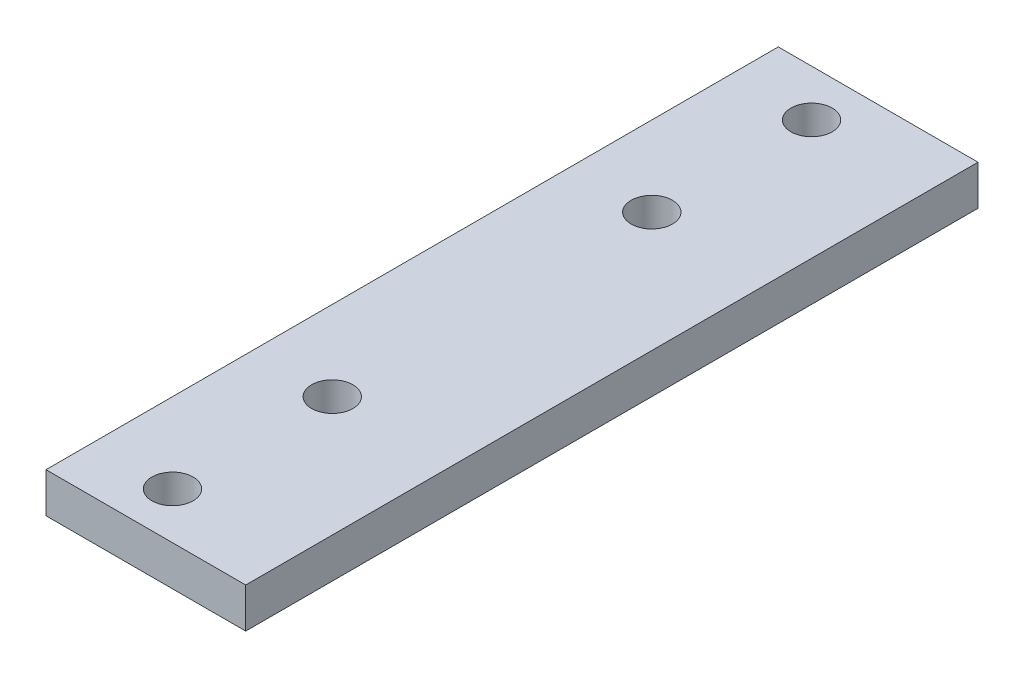
ISO-10303-21;
HEADER;
FILE_DESCRIPTION(('STEP AP214'),'2;1');
FILE_NAME('part.step','',(''),(''),'','','');
FILE_SCHEMA(('AUTOMOTIVE_DESIGN { 1 0 10303 214 1 1 1 1 }'));
ENDSEC;
DATA;
#1=APPLICATION_CONTEXT('core data for automotive mechanical design processes');
#2=APPLICATION_PROTOCOL_DEFINITION('international standard','automotive_design',2000,#1);
#3=PRODUCT_CONTEXT('',#1,'mechanical');
#4=PRODUCT('Part','Part','',(#3));
#5=PRODUCT_RELATED_PRODUCT_CATEGORY('part','',(#4));
#6=PRODUCT_DEFINITION_FORMATION('','',#4);
#7=PRODUCT_DEFINITION_CONTEXT('part definition',#1,'design');
#8=PRODUCT_DEFINITION('design','',#6,#7);
#9=PRODUCT_DEFINITION_SHAPE('','',#8);
#10=(LENGTH_UNIT() NAMED_UNIT(*) SI_UNIT(.MILLI.,.METRE.));
#11=(NAMED_UNIT(*) PLANE_ANGLE_UNIT() SI_UNIT($,.RADIAN.));
#12=(NAMED_UNIT(*) SI_UNIT($,.STERADIAN.) SOLID_ANGLE_UNIT());
#13=UNCERTAINTY_MEASURE_WITH_UNIT(LENGTH_MEASURE(1.E-05),#10,'distance_accuracy_value','');
#14=(GEOMETRIC_REPRESENTATION_CONTEXT(3) GLOBAL_UNCERTAINTY_ASSIGNED_CONTEXT((#13)) GLOBAL_UNIT_ASSIGNED_CONTEXT((#10,
#11,#12)) REPRESENTATION_CONTEXT('',''));
#15=CARTESIAN_POINT('',(0.,0.,0.));
#16=DIRECTION('',(0.,0.,1.));
#17=DIRECTION('',(1.,0.,0.));
#18=AXIS2_PLACEMENT_3D('',#15,#16,#17);
#19=CARTESIAN_POINT('',(0.,0.,-5.));
#20=DIRECTION('',(0.,0.,-1.));
#21=DIRECTION('',(-1.,0.,0.));
#22=AXIS2_PLACEMENT_3D('',#19,#20,#21);
#23=PLANE('',#22);
#24=DIRECTION('',(0.,-1.,0.));
#25=VECTOR('',#24,1.);
#26=CARTESIAN_POINT('',(35.,3.,-5.));
#27=LINE('',#26,#25);
#28=CARTESIAN_POINT('',(35.,3.,-5.));
#29=VERTEX_POINT('',#28);
#30=CARTESIAN_POINT('',(35.,0.,-5.));
#31=VERTEX_POINT('',#30);
#32=EDGE_CURVE('E54',#29,#31,#27,.T.);
#33=ORIENTED_EDGE('',*,*,#32,.T.);
#34=DIRECTION('',(1.,0.,0.));
#35=VECTOR('',#34,1.);
#36=CARTESIAN_POINT('',(-30.,0.,-5.));
#37=LINE('',#36,#35);
#38=CARTESIAN_POINT('',(20.,0.,-5.));
#39=VERTEX_POINT('',#38);
#40=EDGE_CURVE('E93',#39,#31,#37,.T.);
#41=ORIENTED_EDGE('',*,*,#40,.F.);
#42=DIRECTION('',(0.,-1.,0.));
#43=VECTOR('',#42,1.);
#44=CARTESIAN_POINT('',(20.,3.,-5.));
#45=LINE('',#44,#43);
#46=CARTESIAN_POINT('',(20.,3.,-5.));
#47=VERTEX_POINT('',#46);
#48=EDGE_CURVE('E108',#47,#39,#45,.T.);
#49=ORIENTED_EDGE('',*,*,#48,.F.);
#50=DIRECTION('',(-1.,0.,0.));
#51=VECTOR('',#50,1.);
#52=CARTESIAN_POINT('',(35.,3.,-5.));
#53=LINE('',#52,#51);
#54=EDGE_CURVE('E145',#29,#47,#53,.T.);
#55=ORIENTED_EDGE('',*,*,#54,.F.);
#56=EDGE_LOOP('',(#33,#41,#49,#55));
#57=FACE_BOUND('',#56,.T.);
#58=ADVANCED_FACE('F46',(#57),#23,.T.);
#59=CARTESIAN_POINT('',(0.,0.,50.));
#60=DIRECTION('',(0.,0.,1.));
#61=DIRECTION('',(-1.,0.,0.));
#62=AXIS2_PLACEMENT_3D('',#59,#60,#61);
#63=PLANE('',#62);
#64=DIRECTION('',(0.,-1.,0.));
#65=VECTOR('',#64,1.);
#66=CARTESIAN_POINT('',(20.,3.,50.));
#67=LINE('',#66,#65);
#68=CARTESIAN_POINT('',(20.,3.,50.));
#69=VERTEX_POINT('',#68);
#70=CARTESIAN_POINT('',(20.,0.,50.));
#71=VERTEX_POINT('',#70);
#72=EDGE_CURVE('E102',#69,#71,#67,.T.);
#73=ORIENTED_EDGE('',*,*,#72,.T.);
#74=DIRECTION('',(1.,0.,0.));
#75=VECTOR('',#74,1.);
#76=CARTESIAN_POINT('',(-30.,0.,50.));
#77=LINE('',#76,#75);
#78=CARTESIAN_POINT('',(35.,0.,50.));
#79=VERTEX_POINT('',#78);
#80=EDGE_CURVE('E90',#71,#79,#77,.T.);
#81=ORIENTED_EDGE('',*,*,#80,.T.);
#82=DIRECTION('',(0.,-1.,0.));
#83=VECTOR('',#82,1.);
#84=CARTESIAN_POINT('',(35.,3.,50.));
#85=LINE('',#84,#83);
#86=CARTESIAN_POINT('',(35.,3.,50.));
#87=VERTEX_POINT('',#86);
#88=EDGE_CURVE('E100',#87,#79,#85,.T.);
#89=ORIENTED_EDGE('',*,*,#88,.F.);
#90=DIRECTION('',(1.,0.,0.));
#91=VECTOR('',#90,1.);
#92=CARTESIAN_POINT('',(35.,3.,50.));
#93=LINE('',#92,#91);
#94=EDGE_CURVE('E62',#69,#87,#93,.T.);
#95=ORIENTED_EDGE('',*,*,#94,.F.);
#96=EDGE_LOOP('',(#73,#81,#89,#95));
#97=FACE_BOUND('',#96,.T.);
#98=ADVANCED_FACE('F99',(#97),#63,.T.);
#99=CARTESIAN_POINT('',(26.,-2.,-1.5));
#100=DIRECTION('',(0.,1.,0.));
#101=DIRECTION('',(0.,0.,1.));
#102=AXIS2_PLACEMENT_3D('',#99,#100,#101);
#103=CYLINDRICAL_SURFACE('',#102,1.55);
#104=CARTESIAN_POINT('',(26.,3.,-1.5));
#105=DIRECTION('',(0.,1.,0.));
#106=DIRECTION('',(0.,0.,1.));
#107=AXIS2_PLACEMENT_3D('',#104,#105,#106);
#108=CIRCLE('',#107,1.55);
#109=CARTESIAN_POINT('',(26.,3.,0.0499999999999999));
#110=VERTEX_POINT('',#109);
#111=EDGE_CURVE('E140',#110,#110,#108,.T.);
#112=ORIENTED_EDGE('',*,*,#111,.T.);
#113=EDGE_LOOP('',(#112));
#114=FACE_BOUND('',#113,.T.);
#115=CARTESIAN_POINT('',(26.,0.,-1.5));
#116=DIRECTION('',(0.,-1.,0.));
#117=DIRECTION('',(0.,0.,-1.));
#118=AXIS2_PLACEMENT_3D('',#115,#116,#117);
#119=CIRCLE('',#118,1.55);
#120=CARTESIAN_POINT('',(26.,0.,-3.05));
#121=VERTEX_POINT('',#120);
#122=EDGE_CURVE('E49',#121,#121,#119,.F.);
#123=ORIENTED_EDGE('',*,*,#122,.F.);
#124=EDGE_LOOP('',(#123));
#125=FACE_BOUND('',#124,.T.);
#126=ADVANCED_FACE('F167',(#114,#125),#103,.F.);
#127=CARTESIAN_POINT('',(26.,-2.,10.5));
#128=DIRECTION('',(0.,1.,0.));
#129=DIRECTION('',(0.,0.,1.));
#130=AXIS2_PLACEMENT_3D('',#127,#128,#129);
#131=CYLINDRICAL_SURFACE('',#130,1.55);
#132=CARTESIAN_POINT('',(26.,3.,10.5));
#133=DIRECTION('',(0.,1.,0.));
#134=DIRECTION('',(0.,0.,1.));
#135=AXIS2_PLACEMENT_3D('',#132,#133,#134);
#136=CIRCLE('',#135,1.55);
#137=CARTESIAN_POINT('',(26.,3.,12.05));
#138=VERTEX_POINT('',#137);
#139=EDGE_CURVE('E135',#138,#138,#136,.T.);
#140=ORIENTED_EDGE('',*,*,#139,.T.);
#141=EDGE_LOOP('',(#140));
#142=FACE_BOUND('',#141,.T.);
#143=CARTESIAN_POINT('',(26.,0.,10.5));
#144=DIRECTION('',(0.,-1.,0.));
#145=DIRECTION('',(0.,0.,-1.));
#146=AXIS2_PLACEMENT_3D('',#143,#144,#145);
#147=CIRCLE('',#146,1.55);
#148=CARTESIAN_POINT('',(26.,0.,8.95));
#149=VERTEX_POINT('',#148);
#150=EDGE_CURVE('E121',#149,#149,#147,.F.);
#151=ORIENTED_EDGE('',*,*,#150,.F.);
#152=EDGE_LOOP('',(#151));
#153=FACE_BOUND('',#152,.T.);
#154=ADVANCED_FACE('F171',(#142,#153),#131,.F.);
#155=CARTESIAN_POINT('',(26.,-2.,34.5));
#156=DIRECTION('',(0.,1.,0.));
#157=DIRECTION('',(0.,0.,1.));
#158=AXIS2_PLACEMENT_3D('',#155,#156,#157);
#159=CYLINDRICAL_SURFACE('',#158,1.55);
#160=CARTESIAN_POINT('',(26.,3.,34.5));
#161=DIRECTION('',(0.,1.,0.));
#162=DIRECTION('',(0.,0.,-1.));
#163=AXIS2_PLACEMENT_3D('',#160,#161,#162);
#164=CIRCLE('',#163,1.55);
#165=CARTESIAN_POINT('',(26.,3.,32.95));
#166=VERTEX_POINT('',#165);
#167=EDGE_CURVE('E130',#166,#166,#164,.T.);
#168=ORIENTED_EDGE('',*,*,#167,.T.);
#169=EDGE_LOOP('',(#168));
#170=FACE_BOUND('',#169,.T.);
#171=CARTESIAN_POINT('',(26.,0.,34.5));
#172=DIRECTION('',(0.,-1.,0.));
#173=DIRECTION('',(0.,0.,-1.));
#174=AXIS2_PLACEMENT_3D('',#171,#172,#173);
#175=CIRCLE('',#174,1.55);
#176=CARTESIAN_POINT('',(26.,0.,32.95));
#177=VERTEX_POINT('',#176);
#178=EDGE_CURVE('E119',#177,#177,#175,.F.);
#179=ORIENTED_EDGE('',*,*,#178,.F.);
#180=EDGE_LOOP('',(#179));
#181=FACE_BOUND('',#180,.T.);
#182=ADVANCED_FACE('F177',(#170,#181),#159,.F.);
#183=CARTESIAN_POINT('',(26.,-2.,46.5));
#184=DIRECTION('',(0.,1.,0.));
#185=DIRECTION('',(0.,0.,1.));
#186=AXIS2_PLACEMENT_3D('',#183,#184,#185);
#187=CYLINDRICAL_SURFACE('',#186,1.55);
#188=CARTESIAN_POINT('',(26.,3.,46.5));
#189=DIRECTION('',(0.,1.,0.));
#190=DIRECTION('',(0.,0.,-1.));
#191=AXIS2_PLACEMENT_3D('',#188,#189,#190);
#192=CIRCLE('',#191,1.55);
#193=CARTESIAN_POINT('',(26.,3.,44.95));
#194=VERTEX_POINT('',#193);
#195=EDGE_CURVE('E126',#194,#194,#192,.T.);
#196=ORIENTED_EDGE('',*,*,#195,.T.);
#197=EDGE_LOOP('',(#196));
#198=FACE_BOUND('',#197,.T.);
#199=CARTESIAN_POINT('',(26.,0.,46.5));
#200=DIRECTION('',(0.,-1.,0.));
#201=DIRECTION('',(0.,0.,-1.));
#202=AXIS2_PLACEMENT_3D('',#199,#200,#201);
#203=CIRCLE('',#202,1.55);
#204=CARTESIAN_POINT('',(26.,0.,44.95));
#205=VERTEX_POINT('',#204);
#206=EDGE_CURVE('E103',#205,#205,#203,.F.);
#207=ORIENTED_EDGE('',*,*,#206,.F.);
#208=EDGE_LOOP('',(#207));
#209=FACE_BOUND('',#208,.T.);
#210=ADVANCED_FACE('F161',(#198,#209),#187,.F.);
#211=CARTESIAN_POINT('',(35.,3.,-5.));
#212=DIRECTION('',(-1.,0.,0.));
#213=DIRECTION('',(0.,0.,1.));
#214=AXIS2_PLACEMENT_3D('',#211,#212,#213);
#215=PLANE('',#214);
#216=DIRECTION('',(0.,0.,-1.));
#217=VECTOR('',#216,1.);
#218=CARTESIAN_POINT('',(35.,0.,45.));
#219=LINE('',#218,#217);
#220=EDGE_CURVE('E11',#79,#31,#219,.T.);
#221=ORIENTED_EDGE('',*,*,#220,.T.);
#222=ORIENTED_EDGE('',*,*,#32,.F.);
#223=DIRECTION('',(0.,0.,-1.));
#224=VECTOR('',#223,1.);
#225=CARTESIAN_POINT('',(35.,3.,-5.));
#226=LINE('',#225,#224);
#227=EDGE_CURVE('E106',#87,#29,#226,.T.);
#228=ORIENTED_EDGE('',*,*,#227,.F.);
#229=ORIENTED_EDGE('',*,*,#88,.T.);
#230=EDGE_LOOP('',(#221,#222,#228,#229));
#231=FACE_BOUND('',#230,.T.);
#232=ADVANCED_FACE('F105',(#231),#215,.F.);
#233=CARTESIAN_POINT('',(20.,3.,-5.));
#234=DIRECTION('',(1.,0.,0.));
#235=DIRECTION('',(0.,0.,-1.));
#236=AXIS2_PLACEMENT_3D('',#233,#234,#235);
#237=PLANE('',#236);
#238=DIRECTION('',(0.,0.,1.));
#239=VECTOR('',#238,1.);
#240=CARTESIAN_POINT('',(20.,0.,-5.));
#241=LINE('',#240,#239);
#242=EDGE_CURVE('E112',#39,#71,#241,.T.);
#243=ORIENTED_EDGE('',*,*,#242,.T.);
#244=ORIENTED_EDGE('',*,*,#72,.F.);
#245=DIRECTION('',(0.,0.,1.));
#246=VECTOR('',#245,1.);
#247=CARTESIAN_POINT('',(20.,3.,-5.));
#248=LINE('',#247,#246);
#249=EDGE_CURVE('E67',#47,#69,#248,.T.);
#250=ORIENTED_EDGE('',*,*,#249,.F.);
#251=ORIENTED_EDGE('',*,*,#48,.T.);
#252=EDGE_LOOP('',(#243,#244,#250,#251));
#253=FACE_BOUND('',#252,.T.);
#254=ADVANCED_FACE('F151',(#253),#237,.F.);
#255=CARTESIAN_POINT('',(0.,3.,0.));
#256=DIRECTION('',(0.,-1.,0.));
#257=DIRECTION('',(0.,0.,-1.));
#258=AXIS2_PLACEMENT_3D('',#255,#256,#257);
#259=PLANE('',#258);
#260=ORIENTED_EDGE('',*,*,#195,.F.);
#261=EDGE_LOOP('',(#260));
#262=FACE_BOUND('',#261,.T.);
#263=ORIENTED_EDGE('',*,*,#167,.F.);
#264=EDGE_LOOP('',(#263));
#265=FACE_BOUND('',#264,.T.);
#266=ORIENTED_EDGE('',*,*,#139,.F.);
#267=EDGE_LOOP('',(#266));
#268=FACE_BOUND('',#267,.T.);
#269=ORIENTED_EDGE('',*,*,#111,.F.);
#270=EDGE_LOOP('',(#269));
#271=FACE_BOUND('',#270,.T.);
#272=ORIENTED_EDGE('',*,*,#227,.T.);
#273=ORIENTED_EDGE('',*,*,#54,.T.);
#274=ORIENTED_EDGE('',*,*,#249,.T.);
#275=ORIENTED_EDGE('',*,*,#94,.T.);
#276=EDGE_LOOP('',(#272,#273,#274,#275));
#277=FACE_BOUND('',#276,.T.);
#278=ADVANCED_FACE('F148',(#262,#265,#268,#271,#277),#259,.F.);
#279=CARTESIAN_POINT('',(-30.,0.,0.));
#280=DIRECTION('',(0.,-1.,0.));
#281=DIRECTION('',(0.,0.,-1.));
#282=AXIS2_PLACEMENT_3D('',#279,#280,#281);
#283=PLANE('',#282);
#284=ORIENTED_EDGE('',*,*,#206,.T.);
#285=EDGE_LOOP('',(#284));
#286=FACE_BOUND('',#285,.T.);
#287=ORIENTED_EDGE('',*,*,#80,.F.);
#288=ORIENTED_EDGE('',*,*,#242,.F.);
#289=ORIENTED_EDGE('',*,*,#40,.T.);
#290=ORIENTED_EDGE('',*,*,#220,.F.);
#291=EDGE_LOOP('',(#287,#288,#289,#290));
#292=FACE_BOUND('',#291,.T.);
#293=ORIENTED_EDGE('',*,*,#178,.T.);
#294=EDGE_LOOP('',(#293));
#295=FACE_BOUND('',#294,.T.);
#296=ORIENTED_EDGE('',*,*,#150,.T.);
#297=EDGE_LOOP('',(#296));
#298=FACE_BOUND('',#297,.T.);
#299=ORIENTED_EDGE('',*,*,#122,.T.);
#300=EDGE_LOOP('',(#299));
#301=FACE_BOUND('',#300,.T.);
#302=ADVANCED_FACE('F88',(#286,#292,#295,#298,#301),#283,.T.);
#303=CLOSED_SHELL('',(#58,#98,#126,#154,#182,#210,#232,#254,#278,#302));
#304=MANIFOLD_SOLID_BREP('B2',#303);
#305=ADVANCED_BREP_SHAPE_REPRESENTATION('',(#18,#304),#14);
#306=SHAPE_DEFINITION_REPRESENTATION(#9,#305);
ENDSEC;
END-ISO-10303-21;
